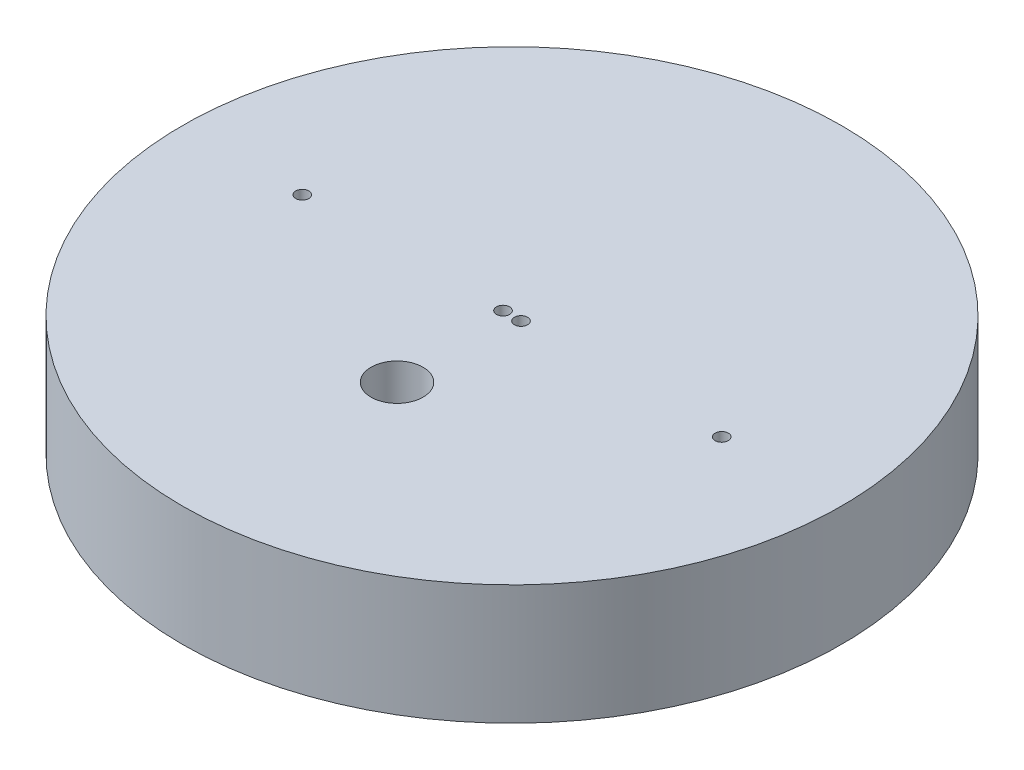
ISO-10303-21;
HEADER;
FILE_DESCRIPTION(('STEP AP214'),'2;1');
FILE_NAME('part.step','',(''),(''),'','','');
FILE_SCHEMA(('AUTOMOTIVE_DESIGN { 1 0 10303 214 1 1 1 1 }'));
ENDSEC;
DATA;
#1=APPLICATION_CONTEXT('core data for automotive mechanical design processes');
#2=APPLICATION_PROTOCOL_DEFINITION('international standard','automotive_design',2000,#1);
#3=PRODUCT_CONTEXT('',#1,'mechanical');
#4=PRODUCT('Part','Part','',(#3));
#5=PRODUCT_RELATED_PRODUCT_CATEGORY('part','',(#4));
#6=PRODUCT_DEFINITION_FORMATION('','',#4);
#7=PRODUCT_DEFINITION_CONTEXT('part definition',#1,'design');
#8=PRODUCT_DEFINITION('design','',#6,#7);
#9=PRODUCT_DEFINITION_SHAPE('','',#8);
#10=(LENGTH_UNIT() NAMED_UNIT(*) SI_UNIT(.MILLI.,.METRE.));
#11=(NAMED_UNIT(*) PLANE_ANGLE_UNIT() SI_UNIT($,.RADIAN.));
#12=(NAMED_UNIT(*) SI_UNIT($,.STERADIAN.) SOLID_ANGLE_UNIT());
#13=UNCERTAINTY_MEASURE_WITH_UNIT(LENGTH_MEASURE(1.E-05),#10,'distance_accuracy_value','');
#14=(GEOMETRIC_REPRESENTATION_CONTEXT(3) GLOBAL_UNCERTAINTY_ASSIGNED_CONTEXT((#13)) GLOBAL_UNIT_ASSIGNED_CONTEXT((#10,
#11,#12)) REPRESENTATION_CONTEXT('',''));
#15=CARTESIAN_POINT('',(0.,0.,0.));
#16=DIRECTION('',(0.,0.,1.));
#17=DIRECTION('',(1.,0.,0.));
#18=AXIS2_PLACEMENT_3D('',#15,#16,#17);
#19=CARTESIAN_POINT('',(0.,67.9505484182622,0.));
#20=DIRECTION('',(0.,1.,0.));
#21=DIRECTION('',(0.,0.,1.));
#22=AXIS2_PLACEMENT_3D('',#19,#20,#21);
#23=PLANE('',#22);
#24=CARTESIAN_POINT('',(-0.75,67.9505484182622,0.));
#25=DIRECTION('',(0.,1.,0.));
#26=DIRECTION('',(0.,0.,1.));
#27=AXIS2_PLACEMENT_3D('',#24,#25,#26);
#28=CIRCLE('',#27,0.55);
#29=CARTESIAN_POINT('',(-0.75,67.9505484182622,0.55));
#30=VERTEX_POINT('',#29);
#31=EDGE_CURVE('E377',#30,#30,#28,.T.);
#32=ORIENTED_EDGE('',*,*,#31,.F.);
#33=EDGE_LOOP('',(#32));
#34=FACE_BOUND('',#33,.T.);
#35=CARTESIAN_POINT('',(0.75,67.9505484182622,0.));
#36=DIRECTION('',(0.,1.,0.));
#37=DIRECTION('',(0.,0.,1.));
#38=AXIS2_PLACEMENT_3D('',#35,#36,#37);
#39=CIRCLE('',#38,0.55);
#40=CARTESIAN_POINT('',(0.75,67.9505484182622,0.55));
#41=VERTEX_POINT('',#40);
#42=EDGE_CURVE('E381',#41,#41,#39,.T.);
#43=ORIENTED_EDGE('',*,*,#42,.F.);
#44=EDGE_LOOP('',(#43));
#45=FACE_BOUND('',#44,.T.);
#46=CARTESIAN_POINT('',(0.,67.9505484182622,9.59397188714907));
#47=DIRECTION('',(0.,1.,0.));
#48=DIRECTION('',(0.,0.,1.));
#49=AXIS2_PLACEMENT_3D('',#46,#47,#48);
#50=CIRCLE('',#49,2.17058187492063);
#51=CARTESIAN_POINT('',(0.,67.9505484182622,11.7645537620697));
#52=VERTEX_POINT('',#51);
#53=EDGE_CURVE('E188',#52,#52,#50,.T.);
#54=ORIENTED_EDGE('',*,*,#53,.F.);
#55=EDGE_LOOP('',(#54));
#56=FACE_BOUND('',#55,.T.);
#57=CARTESIAN_POINT('',(-17.5,67.9505484182622,0.));
#58=DIRECTION('',(0.,1.,0.));
#59=DIRECTION('',(0.,0.,1.));
#60=AXIS2_PLACEMENT_3D('',#57,#58,#59);
#61=CIRCLE('',#60,0.549999999999999);
#62=CARTESIAN_POINT('',(-17.5,67.9505484182622,0.549999999999999));
#63=VERTEX_POINT('',#62);
#64=EDGE_CURVE('E11',#63,#63,#61,.T.);
#65=ORIENTED_EDGE('',*,*,#64,.F.);
#66=EDGE_LOOP('',(#65));
#67=FACE_BOUND('',#66,.T.);
#68=CARTESIAN_POINT('',(17.5,67.9505484182622,0.));
#69=DIRECTION('',(0.,1.,0.));
#70=DIRECTION('',(0.,0.,1.));
#71=AXIS2_PLACEMENT_3D('',#68,#69,#70);
#72=CIRCLE('',#71,0.549999999999999);
#73=CARTESIAN_POINT('',(17.5,67.9505484182622,0.549999999999999));
#74=VERTEX_POINT('',#73);
#75=EDGE_CURVE('E49',#74,#74,#72,.T.);
#76=ORIENTED_EDGE('',*,*,#75,.F.);
#77=EDGE_LOOP('',(#76));
#78=FACE_BOUND('',#77,.T.);
#79=CARTESIAN_POINT('',(0.,67.9505484182622,0.));
#80=DIRECTION('',(0.,1.,0.));
#81=DIRECTION('',(0.,0.,1.));
#82=AXIS2_PLACEMENT_3D('',#79,#80,#81);
#83=CIRCLE('',#82,27.5);
#84=CARTESIAN_POINT('',(0.,67.9505484182622,27.5));
#85=VERTEX_POINT('',#84);
#86=EDGE_CURVE('E186',#85,#85,#83,.T.);
#87=ORIENTED_EDGE('',*,*,#86,.T.);
#88=EDGE_LOOP('',(#87));
#89=FACE_BOUND('',#88,.T.);
#90=ADVANCED_FACE('F40',(#34,#45,#56,#67,#78,#89),#23,.T.);
#91=CARTESIAN_POINT('',(0.,57.9505484182622,0.));
#92=DIRECTION('',(0.,1.,0.));
#93=DIRECTION('',(0.,0.,1.));
#94=AXIS2_PLACEMENT_3D('',#91,#92,#93);
#95=PLANE('',#94);
#96=CARTESIAN_POINT('',(0.,57.9505484182622,25.));
#97=DIRECTION('',(0.,1.,0.));
#98=DIRECTION('',(0.,0.,-1.));
#99=AXIS2_PLACEMENT_3D('',#96,#97,#98);
#100=CIRCLE('',#99,2.50000000000001);
#101=CARTESIAN_POINT('',(2.49687304442978,57.9505484182622,24.875));
#102=VERTEX_POINT('',#101);
#103=CARTESIAN_POINT('',(-2.49687304442978,57.9505484182622,24.875));
#104=VERTEX_POINT('',#103);
#105=EDGE_CURVE('E117',#102,#104,#100,.T.);
#106=ORIENTED_EDGE('',*,*,#105,.F.);
#107=CARTESIAN_POINT('',(0.,57.9505484182622,0.));
#108=DIRECTION('',(0.,-1.,0.));
#109=DIRECTION('',(0.,0.,-1.));
#110=AXIS2_PLACEMENT_3D('',#107,#108,#109);
#111=CIRCLE('',#110,25.);
#112=CARTESIAN_POINT('',(24.875,57.9505484182622,2.49687304442977));
#113=VERTEX_POINT('',#112);
#114=EDGE_CURVE('E154',#113,#102,#111,.T.);
#115=ORIENTED_EDGE('',*,*,#114,.F.);
#116=CARTESIAN_POINT('',(25.,57.9505484182622,0.));
#117=DIRECTION('',(0.,1.,0.));
#118=DIRECTION('',(0.,0.,-1.));
#119=AXIS2_PLACEMENT_3D('',#116,#117,#118);
#120=CIRCLE('',#119,2.5);
#121=CARTESIAN_POINT('',(24.875,57.9505484182622,-2.49687304442977));
#122=VERTEX_POINT('',#121);
#123=EDGE_CURVE('E151',#122,#113,#120,.T.);
#124=ORIENTED_EDGE('',*,*,#123,.F.);
#125=CARTESIAN_POINT('',(0.,57.9505484182622,0.));
#126=DIRECTION('',(0.,-1.,0.));
#127=DIRECTION('',(0.,0.,-1.));
#128=AXIS2_PLACEMENT_3D('',#125,#126,#127);
#129=CIRCLE('',#128,25.);
#130=CARTESIAN_POINT('',(2.49687304442978,57.9505484182622,-24.875));
#131=VERTEX_POINT('',#130);
#132=EDGE_CURVE('E148',#131,#122,#129,.T.);
#133=ORIENTED_EDGE('',*,*,#132,.F.);
#134=CARTESIAN_POINT('',(0.,57.9505484182622,-25.));
#135=DIRECTION('',(0.,1.,0.));
#136=DIRECTION('',(0.,0.,-1.));
#137=AXIS2_PLACEMENT_3D('',#134,#135,#136);
#138=CIRCLE('',#137,2.50000000000001);
#139=CARTESIAN_POINT('',(-2.49687304442978,57.9505484182622,-24.875));
#140=VERTEX_POINT('',#139);
#141=EDGE_CURVE('E144',#140,#131,#138,.T.);
#142=ORIENTED_EDGE('',*,*,#141,.F.);
#143=CARTESIAN_POINT('',(0.,57.9505484182622,0.));
#144=DIRECTION('',(0.,-1.,0.));
#145=DIRECTION('',(0.,0.,-1.));
#146=AXIS2_PLACEMENT_3D('',#143,#144,#145);
#147=CIRCLE('',#146,25.);
#148=CARTESIAN_POINT('',(-24.875,57.9505484182622,-2.49687304442976));
#149=VERTEX_POINT('',#148);
#150=EDGE_CURVE('E57',#149,#140,#147,.T.);
#151=ORIENTED_EDGE('',*,*,#150,.F.);
#152=CARTESIAN_POINT('',(-25.,57.9505484182622,0.));
#153=DIRECTION('',(0.,1.,0.));
#154=DIRECTION('',(0.,0.,-1.));
#155=AXIS2_PLACEMENT_3D('',#152,#153,#154);
#156=CIRCLE('',#155,2.49999999999999);
#157=CARTESIAN_POINT('',(-24.875,57.9505484182622,2.49687304442977));
#158=VERTEX_POINT('',#157);
#159=EDGE_CURVE('E160',#158,#149,#156,.T.);
#160=ORIENTED_EDGE('',*,*,#159,.F.);
#161=CARTESIAN_POINT('',(0.,57.9505484182622,0.));
#162=DIRECTION('',(0.,-1.,0.));
#163=DIRECTION('',(0.,0.,-1.));
#164=AXIS2_PLACEMENT_3D('',#161,#162,#163);
#165=CIRCLE('',#164,25.);
#166=EDGE_CURVE('E158',#104,#158,#165,.T.);
#167=ORIENTED_EDGE('',*,*,#166,.F.);
#168=EDGE_LOOP('',(#106,#115,#124,#133,#142,#151,#160,#167));
#169=FACE_BOUND('',#168,.T.);
#170=CARTESIAN_POINT('',(0.,57.9505484182622,0.));
#171=DIRECTION('',(0.,1.,0.));
#172=DIRECTION('',(0.,0.,1.));
#173=AXIS2_PLACEMENT_3D('',#170,#171,#172);
#174=CIRCLE('',#173,27.5);
#175=CARTESIAN_POINT('',(0.,57.9505484182622,27.5));
#176=VERTEX_POINT('',#175);
#177=EDGE_CURVE('E145',#176,#176,#174,.T.);
#178=ORIENTED_EDGE('',*,*,#177,.F.);
#179=EDGE_LOOP('',(#178));
#180=FACE_BOUND('',#179,.T.);
#181=ADVANCED_FACE('F42',(#169,#180),#95,.F.);
#182=CARTESIAN_POINT('',(17.5,20.9505484182622,0.));
#183=DIRECTION('',(0.,1.,0.));
#184=DIRECTION('',(0.,0.,1.));
#185=AXIS2_PLACEMENT_3D('',#182,#183,#184);
#186=CYLINDRICAL_SURFACE('',#185,0.549999999999999);
#187=ORIENTED_EDGE('',*,*,#75,.T.);
#188=EDGE_LOOP('',(#187));
#189=FACE_BOUND('',#188,.T.);
#190=CARTESIAN_POINT('',(17.5,60.9505484182622,0.));
#191=DIRECTION('',(0.,-1.,0.));
#192=DIRECTION('',(0.,0.,-1.));
#193=AXIS2_PLACEMENT_3D('',#190,#191,#192);
#194=CIRCLE('',#193,0.549999999999999);
#195=CARTESIAN_POINT('',(17.5,60.9505484182622,-0.549999999999999));
#196=VERTEX_POINT('',#195);
#197=EDGE_CURVE('E173',#196,#196,#194,.F.);
#198=ORIENTED_EDGE('',*,*,#197,.F.);
#199=EDGE_LOOP('',(#198));
#200=FACE_BOUND('',#199,.T.);
#201=ADVANCED_FACE('F178',(#189,#200),#186,.F.);
#202=CARTESIAN_POINT('',(-17.5,20.9505484182622,0.));
#203=DIRECTION('',(0.,1.,0.));
#204=DIRECTION('',(0.,0.,1.));
#205=AXIS2_PLACEMENT_3D('',#202,#203,#204);
#206=CYLINDRICAL_SURFACE('',#205,0.549999999999999);
#207=ORIENTED_EDGE('',*,*,#64,.T.);
#208=EDGE_LOOP('',(#207));
#209=FACE_BOUND('',#208,.T.);
#210=CARTESIAN_POINT('',(-17.5,60.9505484182622,0.));
#211=DIRECTION('',(0.,-1.,0.));
#212=DIRECTION('',(0.,0.,-1.));
#213=AXIS2_PLACEMENT_3D('',#210,#211,#212);
#214=CIRCLE('',#213,0.549999999999999);
#215=CARTESIAN_POINT('',(-17.5,60.9505484182622,-0.549999999999999));
#216=VERTEX_POINT('',#215);
#217=EDGE_CURVE('E44',#216,#216,#214,.F.);
#218=ORIENTED_EDGE('',*,*,#217,.F.);
#219=EDGE_LOOP('',(#218));
#220=FACE_BOUND('',#219,.T.);
#221=ADVANCED_FACE('F223',(#209,#220),#206,.F.);
#222=CARTESIAN_POINT('',(0.,60.9505484182622,-12.5));
#223=DIRECTION('',(0.,-1.,0.));
#224=DIRECTION('',(0.,0.,-1.));
#225=AXIS2_PLACEMENT_3D('',#222,#223,#224);
#226=PLANE('',#225);
#227=CARTESIAN_POINT('',(-0.75,60.9505484182622,0.));
#228=DIRECTION('',(0.,-1.,0.));
#229=DIRECTION('',(0.,0.,-1.));
#230=AXIS2_PLACEMENT_3D('',#227,#228,#229);
#231=CIRCLE('',#230,0.55);
#232=CARTESIAN_POINT('',(-0.75,60.9505484182622,-0.55));
#233=VERTEX_POINT('',#232);
#234=EDGE_CURVE('E380',#233,#233,#231,.T.);
#235=ORIENTED_EDGE('',*,*,#234,.F.);
#236=EDGE_LOOP('',(#235));
#237=FACE_BOUND('',#236,.T.);
#238=CARTESIAN_POINT('',(0.75,60.9505484182622,0.));
#239=DIRECTION('',(0.,-1.,0.));
#240=DIRECTION('',(0.,0.,-1.));
#241=AXIS2_PLACEMENT_3D('',#238,#239,#240);
#242=CIRCLE('',#241,0.55);
#243=CARTESIAN_POINT('',(0.75,60.9505484182622,-0.55));
#244=VERTEX_POINT('',#243);
#245=EDGE_CURVE('E382',#244,#244,#242,.T.);
#246=ORIENTED_EDGE('',*,*,#245,.F.);
#247=EDGE_LOOP('',(#246));
#248=FACE_BOUND('',#247,.T.);
#249=CARTESIAN_POINT('',(0.,60.9505484182622,9.59397188714907));
#250=DIRECTION('',(0.,-1.,0.));
#251=DIRECTION('',(0.,0.,-1.));
#252=AXIS2_PLACEMENT_3D('',#249,#250,#251);
#253=CIRCLE('',#252,2.17058187492063);
#254=CARTESIAN_POINT('',(0.,60.9505484182622,7.42339001222844));
#255=VERTEX_POINT('',#254);
#256=EDGE_CURVE('E193',#255,#255,#253,.T.);
#257=ORIENTED_EDGE('',*,*,#256,.F.);
#258=EDGE_LOOP('',(#257));
#259=FACE_BOUND('',#258,.T.);
#260=CARTESIAN_POINT('',(0.,60.9505484182622,0.));
#261=DIRECTION('',(0.,-1.,0.));
#262=DIRECTION('',(0.,0.,-1.));
#263=AXIS2_PLACEMENT_3D('',#260,#261,#262);
#264=CIRCLE('',#263,25.);
#265=CARTESIAN_POINT('',(-24.875,60.9505484182622,-2.49687304442976));
#266=VERTEX_POINT('',#265);
#267=CARTESIAN_POINT('',(-2.49687304442978,60.9505484182622,-24.875));
#268=VERTEX_POINT('',#267);
#269=EDGE_CURVE('E162',#266,#268,#264,.T.);
#270=ORIENTED_EDGE('',*,*,#269,.T.);
#271=CARTESIAN_POINT('',(0.,60.9505484182622,-25.));
#272=DIRECTION('',(0.,1.,0.));
#273=DIRECTION('',(0.,0.,-1.));
#274=AXIS2_PLACEMENT_3D('',#271,#272,#273);
#275=CIRCLE('',#274,2.50000000000001);
#276=CARTESIAN_POINT('',(2.49687304442978,60.9505484182622,-24.875));
#277=VERTEX_POINT('',#276);
#278=EDGE_CURVE('E197',#268,#277,#275,.T.);
#279=ORIENTED_EDGE('',*,*,#278,.T.);
#280=CARTESIAN_POINT('',(0.,60.9505484182622,0.));
#281=DIRECTION('',(0.,-1.,0.));
#282=DIRECTION('',(0.,0.,-1.));
#283=AXIS2_PLACEMENT_3D('',#280,#281,#282);
#284=CIRCLE('',#283,25.);
#285=CARTESIAN_POINT('',(24.875,60.9505484182622,-2.49687304442977));
#286=VERTEX_POINT('',#285);
#287=EDGE_CURVE('E200',#277,#286,#284,.T.);
#288=ORIENTED_EDGE('',*,*,#287,.T.);
#289=CARTESIAN_POINT('',(25.,60.9505484182622,0.));
#290=DIRECTION('',(0.,1.,0.));
#291=DIRECTION('',(0.,0.,-1.));
#292=AXIS2_PLACEMENT_3D('',#289,#290,#291);
#293=CIRCLE('',#292,2.5);
#294=CARTESIAN_POINT('',(24.875,60.9505484182622,2.49687304442977));
#295=VERTEX_POINT('',#294);
#296=EDGE_CURVE('E138',#286,#295,#293,.T.);
#297=ORIENTED_EDGE('',*,*,#296,.T.);
#298=CARTESIAN_POINT('',(0.,60.9505484182622,0.));
#299=DIRECTION('',(0.,-1.,0.));
#300=DIRECTION('',(0.,0.,-1.));
#301=AXIS2_PLACEMENT_3D('',#298,#299,#300);
#302=CIRCLE('',#301,25.);
#303=CARTESIAN_POINT('',(2.49687304442978,60.9505484182622,24.875));
#304=VERTEX_POINT('',#303);
#305=EDGE_CURVE('E136',#295,#304,#302,.T.);
#306=ORIENTED_EDGE('',*,*,#305,.T.);
#307=CARTESIAN_POINT('',(0.,60.9505484182622,25.));
#308=DIRECTION('',(0.,1.,0.));
#309=DIRECTION('',(0.,0.,-1.));
#310=AXIS2_PLACEMENT_3D('',#307,#308,#309);
#311=CIRCLE('',#310,2.50000000000001);
#312=CARTESIAN_POINT('',(-2.49687304442978,60.9505484182622,24.875));
#313=VERTEX_POINT('',#312);
#314=EDGE_CURVE('E114',#304,#313,#311,.T.);
#315=ORIENTED_EDGE('',*,*,#314,.T.);
#316=CARTESIAN_POINT('',(0.,60.9505484182622,0.));
#317=DIRECTION('',(0.,-1.,0.));
#318=DIRECTION('',(0.,0.,-1.));
#319=AXIS2_PLACEMENT_3D('',#316,#317,#318);
#320=CIRCLE('',#319,25.);
#321=CARTESIAN_POINT('',(-24.875,60.9505484182622,2.49687304442977));
#322=VERTEX_POINT('',#321);
#323=EDGE_CURVE('E125',#313,#322,#320,.T.);
#324=ORIENTED_EDGE('',*,*,#323,.T.);
#325=CARTESIAN_POINT('',(-25.,60.9505484182622,0.));
#326=DIRECTION('',(0.,1.,0.));
#327=DIRECTION('',(0.,0.,-1.));
#328=AXIS2_PLACEMENT_3D('',#325,#326,#327);
#329=CIRCLE('',#328,2.49999999999999);
#330=EDGE_CURVE('E129',#322,#266,#329,.T.);
#331=ORIENTED_EDGE('',*,*,#330,.T.);
#332=EDGE_LOOP('',(#270,#279,#288,#297,#306,#315,#324,#331));
#333=FACE_BOUND('',#332,.T.);
#334=ORIENTED_EDGE('',*,*,#217,.T.);
#335=EDGE_LOOP('',(#334));
#336=FACE_BOUND('',#335,.T.);
#337=ORIENTED_EDGE('',*,*,#197,.T.);
#338=EDGE_LOOP('',(#337));
#339=FACE_BOUND('',#338,.T.);
#340=ADVANCED_FACE('F132',(#237,#248,#259,#333,#336,#339),#226,.T.);
#341=CARTESIAN_POINT('',(0.,60.9505484182622,0.));
#342=DIRECTION('',(0.,-1.,0.));
#343=DIRECTION('',(0.,0.,-1.));
#344=AXIS2_PLACEMENT_3D('',#341,#342,#343);
#345=CYLINDRICAL_SURFACE('',#344,25.);
#346=ORIENTED_EDGE('',*,*,#150,.T.);
#347=DIRECTION('',(0.,-1.,0.));
#348=VECTOR('',#347,1.);
#349=CARTESIAN_POINT('',(-2.49687304442978,60.9505484182622,-24.875));
#350=LINE('',#349,#348);
#351=EDGE_CURVE('E93',#268,#140,#350,.T.);
#352=ORIENTED_EDGE('',*,*,#351,.F.);
#353=ORIENTED_EDGE('',*,*,#269,.F.);
#354=DIRECTION('',(0.,-1.,0.));
#355=VECTOR('',#354,1.);
#356=CARTESIAN_POINT('',(-24.875,60.9505484182622,-2.49687304442976));
#357=LINE('',#356,#355);
#358=EDGE_CURVE('E65',#266,#149,#357,.T.);
#359=ORIENTED_EDGE('',*,*,#358,.T.);
#360=EDGE_LOOP('',(#346,#352,#353,#359));
#361=FACE_BOUND('',#360,.T.);
#362=ADVANCED_FACE('F215',(#361),#345,.F.);
#363=CARTESIAN_POINT('',(-25.,60.9505484182622,0.));
#364=DIRECTION('',(0.,-1.,0.));
#365=DIRECTION('',(0.,0.,-1.));
#366=AXIS2_PLACEMENT_3D('',#363,#364,#365);
#367=CYLINDRICAL_SURFACE('',#366,2.49999999999999);
#368=ORIENTED_EDGE('',*,*,#159,.T.);
#369=ORIENTED_EDGE('',*,*,#358,.F.);
#370=ORIENTED_EDGE('',*,*,#330,.F.);
#371=DIRECTION('',(0.,-1.,0.));
#372=VECTOR('',#371,1.);
#373=CARTESIAN_POINT('',(-24.875,60.9505484182622,2.49687304442977));
#374=LINE('',#373,#372);
#375=EDGE_CURVE('E121',#322,#158,#374,.T.);
#376=ORIENTED_EDGE('',*,*,#375,.T.);
#377=EDGE_LOOP('',(#368,#369,#370,#376));
#378=FACE_BOUND('',#377,.T.);
#379=ADVANCED_FACE('F214',(#378),#367,.T.);
#380=CARTESIAN_POINT('',(0.,60.9505484182622,0.));
#381=DIRECTION('',(0.,-1.,0.));
#382=DIRECTION('',(0.,0.,-1.));
#383=AXIS2_PLACEMENT_3D('',#380,#381,#382);
#384=CYLINDRICAL_SURFACE('',#383,25.);
#385=ORIENTED_EDGE('',*,*,#166,.T.);
#386=ORIENTED_EDGE('',*,*,#375,.F.);
#387=ORIENTED_EDGE('',*,*,#323,.F.);
#388=DIRECTION('',(0.,-1.,0.));
#389=VECTOR('',#388,1.);
#390=CARTESIAN_POINT('',(-2.49687304442978,60.9505484182622,24.875));
#391=LINE('',#390,#389);
#392=EDGE_CURVE('E110',#313,#104,#391,.T.);
#393=ORIENTED_EDGE('',*,*,#392,.T.);
#394=EDGE_LOOP('',(#385,#386,#387,#393));
#395=FACE_BOUND('',#394,.T.);
#396=ADVANCED_FACE('F126',(#395),#384,.F.);
#397=CARTESIAN_POINT('',(0.,60.9505484182622,25.));
#398=DIRECTION('',(0.,-1.,0.));
#399=DIRECTION('',(0.,0.,-1.));
#400=AXIS2_PLACEMENT_3D('',#397,#398,#399);
#401=CYLINDRICAL_SURFACE('',#400,2.50000000000001);
#402=ORIENTED_EDGE('',*,*,#105,.T.);
#403=ORIENTED_EDGE('',*,*,#392,.F.);
#404=ORIENTED_EDGE('',*,*,#314,.F.);
#405=DIRECTION('',(0.,-1.,0.));
#406=VECTOR('',#405,1.);
#407=CARTESIAN_POINT('',(2.49687304442978,60.9505484182622,24.875));
#408=LINE('',#407,#406);
#409=EDGE_CURVE('E122',#304,#102,#408,.T.);
#410=ORIENTED_EDGE('',*,*,#409,.T.);
#411=EDGE_LOOP('',(#402,#403,#404,#410));
#412=FACE_BOUND('',#411,.T.);
#413=ADVANCED_FACE('F112',(#412),#401,.T.);
#414=CARTESIAN_POINT('',(0.,60.9505484182622,0.));
#415=DIRECTION('',(0.,-1.,0.));
#416=DIRECTION('',(0.,0.,-1.));
#417=AXIS2_PLACEMENT_3D('',#414,#415,#416);
#418=CYLINDRICAL_SURFACE('',#417,25.);
#419=ORIENTED_EDGE('',*,*,#114,.T.);
#420=ORIENTED_EDGE('',*,*,#409,.F.);
#421=ORIENTED_EDGE('',*,*,#305,.F.);
#422=DIRECTION('',(0.,-1.,0.));
#423=VECTOR('',#422,1.);
#424=CARTESIAN_POINT('',(24.875,60.9505484182622,2.49687304442977));
#425=LINE('',#424,#423);
#426=EDGE_CURVE('E166',#295,#113,#425,.T.);
#427=ORIENTED_EDGE('',*,*,#426,.T.);
#428=EDGE_LOOP('',(#419,#420,#421,#427));
#429=FACE_BOUND('',#428,.T.);
#430=ADVANCED_FACE('F209',(#429),#418,.F.);
#431=CARTESIAN_POINT('',(25.,60.9505484182622,0.));
#432=DIRECTION('',(0.,-1.,0.));
#433=DIRECTION('',(0.,0.,-1.));
#434=AXIS2_PLACEMENT_3D('',#431,#432,#433);
#435=CYLINDRICAL_SURFACE('',#434,2.5);
#436=ORIENTED_EDGE('',*,*,#123,.T.);
#437=ORIENTED_EDGE('',*,*,#426,.F.);
#438=ORIENTED_EDGE('',*,*,#296,.F.);
#439=DIRECTION('',(0.,-1.,0.));
#440=VECTOR('',#439,1.);
#441=CARTESIAN_POINT('',(24.875,60.9505484182622,-2.49687304442977));
#442=LINE('',#441,#440);
#443=EDGE_CURVE('E168',#286,#122,#442,.T.);
#444=ORIENTED_EDGE('',*,*,#443,.T.);
#445=EDGE_LOOP('',(#436,#437,#438,#444));
#446=FACE_BOUND('',#445,.T.);
#447=ADVANCED_FACE('F205',(#446),#435,.T.);
#448=CARTESIAN_POINT('',(0.,60.9505484182622,0.));
#449=DIRECTION('',(0.,-1.,0.));
#450=DIRECTION('',(0.,0.,-1.));
#451=AXIS2_PLACEMENT_3D('',#448,#449,#450);
#452=CYLINDRICAL_SURFACE('',#451,25.);
#453=ORIENTED_EDGE('',*,*,#132,.T.);
#454=ORIENTED_EDGE('',*,*,#443,.F.);
#455=ORIENTED_EDGE('',*,*,#287,.F.);
#456=DIRECTION('',(0.,-1.,0.));
#457=VECTOR('',#456,1.);
#458=CARTESIAN_POINT('',(2.49687304442978,60.9505484182622,-24.875));
#459=LINE('',#458,#457);
#460=EDGE_CURVE('E170',#277,#131,#459,.T.);
#461=ORIENTED_EDGE('',*,*,#460,.T.);
#462=EDGE_LOOP('',(#453,#454,#455,#461));
#463=FACE_BOUND('',#462,.T.);
#464=ADVANCED_FACE('F298',(#463),#452,.F.);
#465=CARTESIAN_POINT('',(0.,60.9505484182622,-25.));
#466=DIRECTION('',(0.,-1.,0.));
#467=DIRECTION('',(0.,0.,-1.));
#468=AXIS2_PLACEMENT_3D('',#465,#466,#467);
#469=CYLINDRICAL_SURFACE('',#468,2.50000000000001);
#470=ORIENTED_EDGE('',*,*,#141,.T.);
#471=ORIENTED_EDGE('',*,*,#460,.F.);
#472=ORIENTED_EDGE('',*,*,#278,.F.);
#473=ORIENTED_EDGE('',*,*,#351,.T.);
#474=EDGE_LOOP('',(#470,#471,#472,#473));
#475=FACE_BOUND('',#474,.T.);
#476=ADVANCED_FACE('F228',(#475),#469,.T.);
#477=CARTESIAN_POINT('',(0.,57.9505484182622,0.));
#478=DIRECTION('',(0.,1.,0.));
#479=DIRECTION('',(0.,0.,1.));
#480=AXIS2_PLACEMENT_3D('',#477,#478,#479);
#481=CYLINDRICAL_SURFACE('',#480,27.5);
#482=ORIENTED_EDGE('',*,*,#177,.T.);
#483=EDGE_LOOP('',(#482));
#484=FACE_BOUND('',#483,.T.);
#485=ORIENTED_EDGE('',*,*,#86,.F.);
#486=EDGE_LOOP('',(#485));
#487=FACE_BOUND('',#486,.T.);
#488=ADVANCED_FACE('F257',(#484,#487),#481,.T.);
#489=CARTESIAN_POINT('',(0.,71.9505484182622,9.59397188714907));
#490=DIRECTION('',(0.,-1.,0.));
#491=DIRECTION('',(0.,0.,-1.));
#492=AXIS2_PLACEMENT_3D('',#489,#490,#491);
#493=CYLINDRICAL_SURFACE('',#492,2.17058187492063);
#494=ORIENTED_EDGE('',*,*,#53,.T.);
#495=EDGE_LOOP('',(#494));
#496=FACE_BOUND('',#495,.T.);
#497=ORIENTED_EDGE('',*,*,#256,.T.);
#498=EDGE_LOOP('',(#497));
#499=FACE_BOUND('',#498,.T.);
#500=ADVANCED_FACE('F261',(#496,#499),#493,.F.);
#501=CARTESIAN_POINT('',(0.75,71.9505484182622,0.));
#502=DIRECTION('',(0.,-1.,0.));
#503=DIRECTION('',(0.,0.,-1.));
#504=AXIS2_PLACEMENT_3D('',#501,#502,#503);
#505=CYLINDRICAL_SURFACE('',#504,0.55);
#506=ORIENTED_EDGE('',*,*,#42,.T.);
#507=EDGE_LOOP('',(#506));
#508=FACE_BOUND('',#507,.T.);
#509=ORIENTED_EDGE('',*,*,#245,.T.);
#510=EDGE_LOOP('',(#509));
#511=FACE_BOUND('',#510,.T.);
#512=ADVANCED_FACE('F275',(#508,#511),#505,.F.);
#513=CARTESIAN_POINT('',(-0.75,71.9505484182622,0.));
#514=DIRECTION('',(0.,-1.,0.));
#515=DIRECTION('',(0.,0.,-1.));
#516=AXIS2_PLACEMENT_3D('',#513,#514,#515);
#517=CYLINDRICAL_SURFACE('',#516,0.55);
#518=ORIENTED_EDGE('',*,*,#31,.T.);
#519=EDGE_LOOP('',(#518));
#520=FACE_BOUND('',#519,.T.);
#521=ORIENTED_EDGE('',*,*,#234,.T.);
#522=EDGE_LOOP('',(#521));
#523=FACE_BOUND('',#522,.T.);
#524=ADVANCED_FACE('F253',(#520,#523),#517,.F.);
#525=CLOSED_SHELL('',(#90,#181,#201,#221,#340,#362,#379,#396,#413,#430,#447,#464,#476,#488,#500,
#512,#524));
#526=MANIFOLD_SOLID_BREP('B2',#525);
#527=ADVANCED_BREP_SHAPE_REPRESENTATION('',(#18,#526),#14);
#528=SHAPE_DEFINITION_REPRESENTATION(#9,#527);
ENDSEC;
END-ISO-10303-21;
